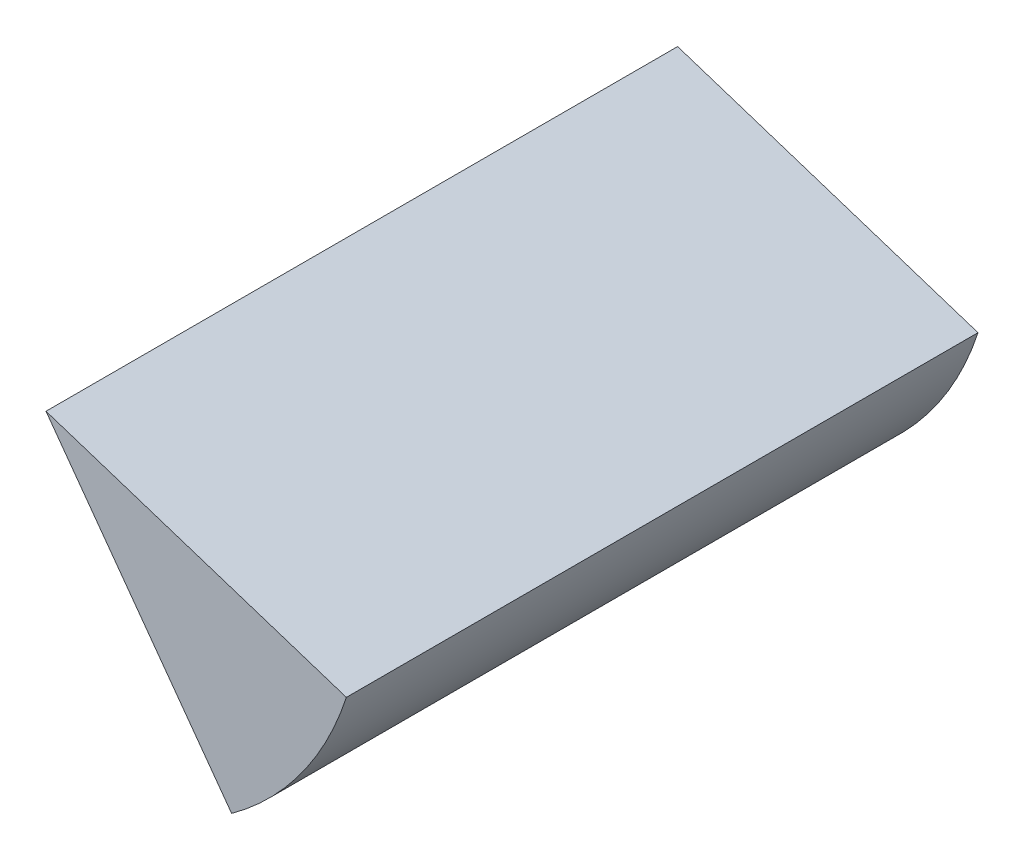
ISO-10303-21;
HEADER;
FILE_DESCRIPTION(('STEP AP214'),'2;1');
FILE_NAME('part.step','',(''),(''),'','','');
FILE_SCHEMA(('AUTOMOTIVE_DESIGN { 1 0 10303 214 1 1 1 1 }'));
ENDSEC;
DATA;
#1=APPLICATION_CONTEXT('core data for automotive mechanical design processes');
#2=APPLICATION_PROTOCOL_DEFINITION('international standard','automotive_design',2000,#1);
#3=PRODUCT_CONTEXT('',#1,'mechanical');
#4=PRODUCT('Part','Part','',(#3));
#5=PRODUCT_RELATED_PRODUCT_CATEGORY('part','',(#4));
#6=PRODUCT_DEFINITION_FORMATION('','',#4);
#7=PRODUCT_DEFINITION_CONTEXT('part definition',#1,'design');
#8=PRODUCT_DEFINITION('design','',#6,#7);
#9=PRODUCT_DEFINITION_SHAPE('','',#8);
#10=(LENGTH_UNIT() NAMED_UNIT(*) SI_UNIT(.MILLI.,.METRE.));
#11=(NAMED_UNIT(*) PLANE_ANGLE_UNIT() SI_UNIT($,.RADIAN.));
#12=(NAMED_UNIT(*) SI_UNIT($,.STERADIAN.) SOLID_ANGLE_UNIT());
#13=UNCERTAINTY_MEASURE_WITH_UNIT(LENGTH_MEASURE(1.E-05),#10,'distance_accuracy_value','');
#14=(GEOMETRIC_REPRESENTATION_CONTEXT(3) GLOBAL_UNCERTAINTY_ASSIGNED_CONTEXT((#13)) GLOBAL_UNIT_ASSIGNED_CONTEXT((#10,
#11,#12)) REPRESENTATION_CONTEXT('',''));
#15=CARTESIAN_POINT('',(0.,0.,0.));
#16=DIRECTION('',(0.,0.,1.));
#17=DIRECTION('',(1.,0.,0.));
#18=AXIS2_PLACEMENT_3D('',#15,#16,#17);
#19=CARTESIAN_POINT('',(0.,0.,50.));
#20=DIRECTION('',(-0.309016994374943,-0.951056516295155,0.));
#21=DIRECTION('',(0.951056516295155,-0.309016994374943,0.));
#22=AXIS2_PLACEMENT_3D('',#19,#20,#21);
#23=PLANE('',#22);
#24=DIRECTION('',(-0.951056516295155,0.309016994374944,0.));
#25=VECTOR('',#24,1.);
#26=CARTESIAN_POINT('',(0.,0.,0.));
#27=LINE('',#26,#25);
#28=CARTESIAN_POINT('',(23.7764129073789,-7.72542485937359,0.));
#29=VERTEX_POINT('',#28);
#30=CARTESIAN_POINT('',(0.,0.,0.));
#31=VERTEX_POINT('',#30);
#32=EDGE_CURVE('E80',#29,#31,#27,.T.);
#33=ORIENTED_EDGE('',*,*,#32,.T.);
#34=DIRECTION('',(0.,0.,-1.));
#35=VECTOR('',#34,1.);
#36=CARTESIAN_POINT('',(0.,0.,50.));
#37=LINE('',#36,#35);
#38=CARTESIAN_POINT('',(0.,0.,50.));
#39=VERTEX_POINT('',#38);
#40=EDGE_CURVE('E11',#39,#31,#37,.T.);
#41=ORIENTED_EDGE('',*,*,#40,.F.);
#42=DIRECTION('',(-0.951056516295155,0.309016994374944,0.));
#43=VECTOR('',#42,1.);
#44=CARTESIAN_POINT('',(0.,0.,50.));
#45=LINE('',#44,#43);
#46=CARTESIAN_POINT('',(23.7764129073789,-7.72542485937359,50.));
#47=VERTEX_POINT('',#46);
#48=EDGE_CURVE('E73',#47,#39,#45,.T.);
#49=ORIENTED_EDGE('',*,*,#48,.F.);
#50=DIRECTION('',(0.,0.,-1.));
#51=VECTOR('',#50,1.);
#52=CARTESIAN_POINT('',(23.7764129073789,-7.72542485937359,50.));
#53=LINE('',#52,#51);
#54=EDGE_CURVE('E81',#47,#29,#53,.T.);
#55=ORIENTED_EDGE('',*,*,#54,.T.);
#56=EDGE_LOOP('',(#33,#41,#49,#55));
#57=FACE_BOUND('',#56,.T.);
#58=ADVANCED_FACE('F33',(#57),#23,.F.);
#59=CARTESIAN_POINT('',(0.,0.,50.));
#60=DIRECTION('',(0.809016994374946,0.587785252292475,0.));
#61=DIRECTION('',(-0.587785252292475,0.809016994374946,0.));
#62=AXIS2_PLACEMENT_3D('',#59,#60,#61);
#63=PLANE('',#62);
#64=DIRECTION('',(0.587785252292475,-0.809016994374946,0.));
#65=VECTOR('',#64,1.);
#66=CARTESIAN_POINT('',(0.,0.,0.));
#67=LINE('',#66,#65);
#68=CARTESIAN_POINT('',(14.6946313073119,-20.2254248593737,0.));
#69=VERTEX_POINT('',#68);
#70=EDGE_CURVE('E61',#31,#69,#67,.T.);
#71=ORIENTED_EDGE('',*,*,#70,.T.);
#72=DIRECTION('',(0.,0.,-1.));
#73=VECTOR('',#72,1.);
#74=CARTESIAN_POINT('',(14.6946313073119,-20.2254248593737,50.));
#75=LINE('',#74,#73);
#76=CARTESIAN_POINT('',(14.6946313073119,-20.2254248593737,50.));
#77=VERTEX_POINT('',#76);
#78=EDGE_CURVE('E41',#77,#69,#75,.T.);
#79=ORIENTED_EDGE('',*,*,#78,.F.);
#80=DIRECTION('',(0.587785252292475,-0.809016994374946,0.));
#81=VECTOR('',#80,1.);
#82=CARTESIAN_POINT('',(0.,0.,50.));
#83=LINE('',#82,#81);
#84=EDGE_CURVE('E69',#39,#77,#83,.T.);
#85=ORIENTED_EDGE('',*,*,#84,.F.);
#86=ORIENTED_EDGE('',*,*,#40,.T.);
#87=EDGE_LOOP('',(#71,#79,#85,#86));
#88=FACE_BOUND('',#87,.T.);
#89=ADVANCED_FACE('F70',(#88),#63,.F.);
#90=CARTESIAN_POINT('',(0.,0.,50.));
#91=DIRECTION('',(0.,0.,-1.));
#92=DIRECTION('',(-1.,0.,0.));
#93=AXIS2_PLACEMENT_3D('',#90,#91,#92);
#94=CYLINDRICAL_SURFACE('',#93,25.);
#95=CARTESIAN_POINT('',(0.,0.,0.));
#96=DIRECTION('',(0.,0.,1.));
#97=DIRECTION('',(1.,0.,0.));
#98=AXIS2_PLACEMENT_3D('',#95,#96,#97);
#99=CIRCLE('',#98,25.);
#100=EDGE_CURVE('E66',#69,#29,#99,.T.);
#101=ORIENTED_EDGE('',*,*,#100,.T.);
#102=ORIENTED_EDGE('',*,*,#54,.F.);
#103=CARTESIAN_POINT('',(0.,0.,50.));
#104=DIRECTION('',(0.,0.,1.));
#105=DIRECTION('',(1.,0.,0.));
#106=AXIS2_PLACEMENT_3D('',#103,#104,#105);
#107=CIRCLE('',#106,25.);
#108=EDGE_CURVE('E49',#77,#47,#107,.T.);
#109=ORIENTED_EDGE('',*,*,#108,.F.);
#110=ORIENTED_EDGE('',*,*,#78,.T.);
#111=EDGE_LOOP('',(#101,#102,#109,#110));
#112=FACE_BOUND('',#111,.T.);
#113=ADVANCED_FACE('F92',(#112),#94,.T.);
#114=CARTESIAN_POINT('',(0.,0.,50.));
#115=DIRECTION('',(0.,0.,1.));
#116=DIRECTION('',(1.,0.,0.));
#117=AXIS2_PLACEMENT_3D('',#114,#115,#116);
#118=PLANE('',#117);
#119=ORIENTED_EDGE('',*,*,#48,.T.);
#120=ORIENTED_EDGE('',*,*,#84,.T.);
#121=ORIENTED_EDGE('',*,*,#108,.T.);
#122=EDGE_LOOP('',(#119,#120,#121));
#123=FACE_BOUND('',#122,.T.);
#124=ADVANCED_FACE('F76',(#123),#118,.T.);
#125=CARTESIAN_POINT('',(0.,0.,0.));
#126=DIRECTION('',(0.,0.,1.));
#127=DIRECTION('',(1.,0.,0.));
#128=AXIS2_PLACEMENT_3D('',#125,#126,#127);
#129=PLANE('',#128);
#130=CARTESIAN_POINT('',(15.3849489426373,-10.8874271218075,0.));
#131=DIRECTION('',(0.,0.,-1.));
#132=DIRECTION('',(-1.,0.,0.));
#133=AXIS2_PLACEMENT_3D('',#130,#131,#132);
#134=CIRCLE('',#133,5.02220593948773);
#135=CARTESIAN_POINT('',(10.3627430031496,-10.8874271218075,0.));
#136=VERTEX_POINT('',#135);
#137=EDGE_CURVE('E87',#136,#136,#134,.T.);
#138=ORIENTED_EDGE('',*,*,#137,.F.);
#139=EDGE_LOOP('',(#138));
#140=FACE_BOUND('',#139,.T.);
#141=ORIENTED_EDGE('',*,*,#32,.F.);
#142=ORIENTED_EDGE('',*,*,#100,.F.);
#143=ORIENTED_EDGE('',*,*,#70,.F.);
#144=EDGE_LOOP('',(#141,#142,#143));
#145=FACE_BOUND('',#144,.T.);
#146=ADVANCED_FACE('F93',(#140,#145),#129,.F.);
#147=CARTESIAN_POINT('',(15.3849489426373,-10.8874271218075,10.));
#148=DIRECTION('',(0.,0.,-1.));
#149=DIRECTION('',(-1.,0.,0.));
#150=AXIS2_PLACEMENT_3D('',#147,#148,#149);
#151=CYLINDRICAL_SURFACE('',#150,5.02220593948773);
#152=CARTESIAN_POINT('',(15.3849489426373,-10.8874271218075,10.));
#153=DIRECTION('',(0.,0.,-1.));
#154=DIRECTION('',(-1.,0.,0.));
#155=AXIS2_PLACEMENT_3D('',#152,#153,#154);
#156=CIRCLE('',#155,5.02220593948773);
#157=CARTESIAN_POINT('',(10.3627430031496,-10.8874271218075,10.));
#158=VERTEX_POINT('',#157);
#159=EDGE_CURVE('E83',#158,#158,#156,.T.);
#160=ORIENTED_EDGE('',*,*,#159,.F.);
#161=EDGE_LOOP('',(#160));
#162=FACE_BOUND('',#161,.T.);
#163=ORIENTED_EDGE('',*,*,#137,.T.);
#164=EDGE_LOOP('',(#163));
#165=FACE_BOUND('',#164,.T.);
#166=ADVANCED_FACE('F95',(#162,#165),#151,.F.);
#167=CARTESIAN_POINT('',(15.3849489426373,-10.8874271218075,10.));
#168=DIRECTION('',(0.,0.,-1.));
#169=DIRECTION('',(-1.,0.,0.));
#170=AXIS2_PLACEMENT_3D('',#167,#168,#169);
#171=PLANE('',#170);
#172=ORIENTED_EDGE('',*,*,#159,.T.);
#173=EDGE_LOOP('',(#172));
#174=FACE_BOUND('',#173,.T.);
#175=ADVANCED_FACE('F102',(#174),#171,.T.);
#176=CLOSED_SHELL('',(#58,#89,#113,#124,#146,#166,#175));
#177=MANIFOLD_SOLID_BREP('B2',#176);
#178=ADVANCED_BREP_SHAPE_REPRESENTATION('',(#18,#177),#14);
#179=SHAPE_DEFINITION_REPRESENTATION(#9,#178);
ENDSEC;
END-ISO-10303-21;
